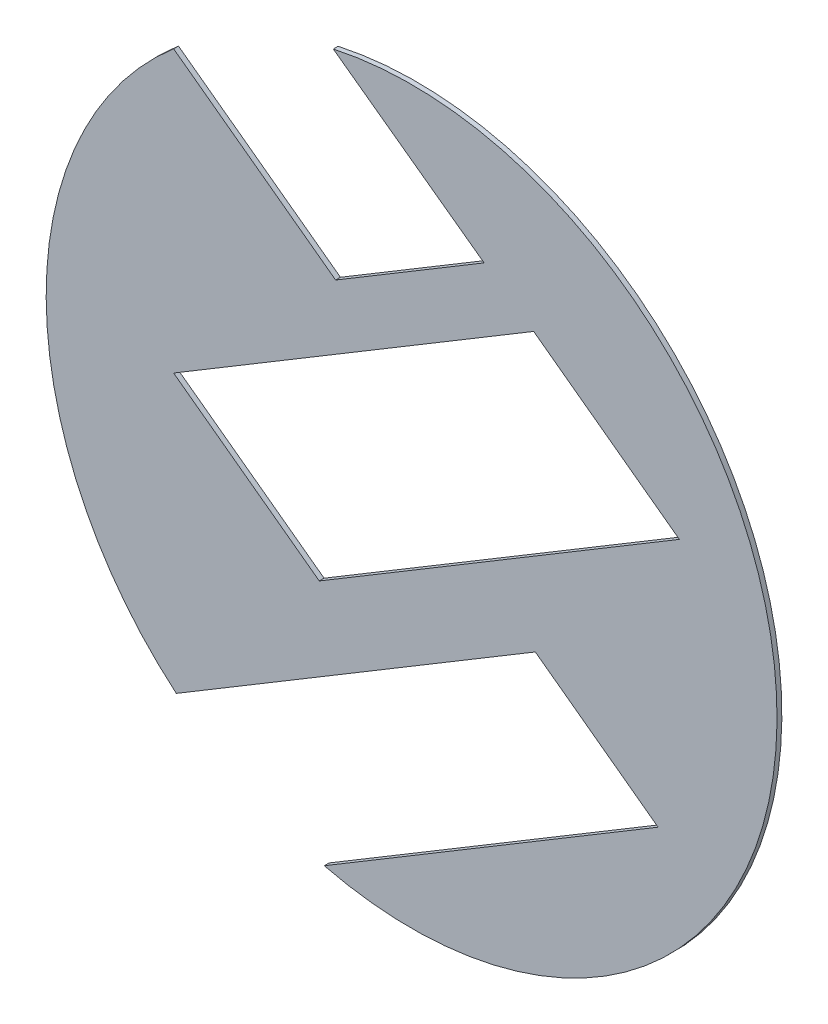
ISO-10303-21;
HEADER;
FILE_DESCRIPTION(('STEP AP214'),'2;1');
FILE_NAME('part.step','',(''),(''),'','','');
FILE_SCHEMA(('AUTOMOTIVE_DESIGN { 1 0 10303 214 1 1 1 1 }'));
ENDSEC;
DATA;
#1=APPLICATION_CONTEXT('core data for automotive mechanical design processes');
#2=APPLICATION_PROTOCOL_DEFINITION('international standard','automotive_design',2000,#1);
#3=PRODUCT_CONTEXT('',#1,'mechanical');
#4=PRODUCT('Part','Part','',(#3));
#5=PRODUCT_RELATED_PRODUCT_CATEGORY('part','',(#4));
#6=PRODUCT_DEFINITION_FORMATION('','',#4);
#7=PRODUCT_DEFINITION_CONTEXT('part definition',#1,'design');
#8=PRODUCT_DEFINITION('design','',#6,#7);
#9=PRODUCT_DEFINITION_SHAPE('','',#8);
#10=(LENGTH_UNIT() NAMED_UNIT(*) SI_UNIT(.MILLI.,.METRE.));
#11=(NAMED_UNIT(*) PLANE_ANGLE_UNIT() SI_UNIT($,.RADIAN.));
#12=(NAMED_UNIT(*) SI_UNIT($,.STERADIAN.) SOLID_ANGLE_UNIT());
#13=UNCERTAINTY_MEASURE_WITH_UNIT(LENGTH_MEASURE(1.E-05),#10,'distance_accuracy_value','');
#14=(GEOMETRIC_REPRESENTATION_CONTEXT(3) GLOBAL_UNCERTAINTY_ASSIGNED_CONTEXT((#13)) GLOBAL_UNIT_ASSIGNED_CONTEXT((#10,
#11,#12)) REPRESENTATION_CONTEXT('',''));
#15=CARTESIAN_POINT('',(0.,0.,0.));
#16=DIRECTION('',(0.,0.,1.));
#17=DIRECTION('',(1.,0.,0.));
#18=AXIS2_PLACEMENT_3D('',#15,#16,#17);
#19=CARTESIAN_POINT('',(32.574920494297,13.734089114766,2.64));
#20=DIRECTION('',(0.,0.,1.));
#21=DIRECTION('',(1.,0.,0.));
#22=AXIS2_PLACEMENT_3D('',#19,#20,#21);
#23=PLANE('',#22);
#24=DIRECTION('',(-0.857492968552989,-0.514495684026778,0.));
#25=VECTOR('',#24,1.);
#26=CARTESIAN_POINT('',(31.96764281084,16.658221601658,2.64));
#27=LINE('',#26,#25);
#28=CARTESIAN_POINT('',(31.9676428108399,16.6582216016581,2.64));
#29=VERTEX_POINT('',#28);
#30=CARTESIAN_POINT('',(31.2743120899405,16.2422232476328,2.64));
#31=VERTEX_POINT('',#30);
#32=EDGE_CURVE('E112',#29,#31,#27,.T.);
#33=ORIENTED_EDGE('',*,*,#32,.F.);
#34=DIRECTION('',(0.805324891886565,-0.592833719105022,0.));
#35=VECTOR('',#34,1.);
#36=CARTESIAN_POINT('',(31.712691111678,16.845902332167,2.64));
#37=LINE('',#36,#35);
#38=CARTESIAN_POINT('',(31.7126911116781,16.8459023321671,2.64));
#39=VERTEX_POINT('',#38);
#40=EDGE_CURVE('E110',#39,#29,#37,.T.);
#41=ORIENTED_EDGE('',*,*,#40,.F.);
#42=DIRECTION('',(0.857492968552828,0.514495684027046,0.));
#43=VECTOR('',#42,1.);
#44=CARTESIAN_POINT('',(30.967015287481,16.398496922091,2.64));
#45=LINE('',#44,#43);
#46=CARTESIAN_POINT('',(30.9670153066098,16.3984969335682,2.64));
#47=VERTEX_POINT('',#46);
#48=EDGE_CURVE('E98',#47,#39,#45,.T.);
#49=ORIENTED_EDGE('',*,*,#48,.F.);
#50=CARTESIAN_POINT('',(31.455723480902,16.979222091636,2.64));
#51=DIRECTION('',(0.,0.,-1.));
#52=DIRECTION('',(-1.,0.,0.));
#53=AXIS2_PLACEMENT_3D('',#50,#51,#52);
#54=CIRCLE('',#53,0.7589976);
#55=CARTESIAN_POINT('',(30.9614312897238,17.5552017670986,2.64));
#56=VERTEX_POINT('',#55);
#57=EDGE_CURVE('E20',#56,#47,#54,.F.);
#58=ORIENTED_EDGE('',*,*,#57,.F.);
#59=DIRECTION('',(-0.805324891886777,0.592833719104734,0.));
#60=VECTOR('',#59,1.);
#61=CARTESIAN_POINT('',(31.29792194646,17.307496766622,2.64));
#62=LINE('',#61,#60);
#63=CARTESIAN_POINT('',(31.29792194646,17.307496766622,2.64));
#64=VERTEX_POINT('',#63);
#65=EDGE_CURVE('E85',#64,#56,#62,.T.);
#66=ORIENTED_EDGE('',*,*,#65,.F.);
#67=DIRECTION('',(-0.857492968551301,-0.514495684029593,0.));
#68=VECTOR('',#67,1.);
#69=CARTESIAN_POINT('',(31.606329475251,17.492541248973,2.64));
#70=LINE('',#69,#68);
#71=CARTESIAN_POINT('',(31.6063294752512,17.4925412489727,2.64));
#72=VERTEX_POINT('',#71);
#73=EDGE_CURVE('E121',#72,#64,#70,.T.);
#74=ORIENTED_EDGE('',*,*,#73,.F.);
#75=DIRECTION('',(0.808430669272843,-0.588591414292685,0.));
#76=VECTOR('',#75,1.);
#77=CARTESIAN_POINT('',(31.293100053242,17.720593146935,2.64));
#78=LINE('',#77,#76);
#79=CARTESIAN_POINT('',(31.2931000760404,17.7205931303365,2.64));
#80=VERTEX_POINT('',#79);
#81=EDGE_CURVE('E124',#80,#72,#78,.T.);
#82=ORIENTED_EDGE('',*,*,#81,.F.);
#83=CARTESIAN_POINT('',(31.455723480902,16.979222091636,2.64));
#84=DIRECTION('',(0.,0.,-1.));
#85=DIRECTION('',(-1.,0.,0.));
#86=AXIS2_PLACEMENT_3D('',#83,#84,#85);
#87=CIRCLE('',#86,0.7589976);
#88=EDGE_CURVE('E140',#31,#80,#87,.F.);
#89=ORIENTED_EDGE('',*,*,#88,.F.);
#90=EDGE_LOOP('',(#33,#41,#49,#58,#66,#74,#82,#89));
#91=FACE_BOUND('',#90,.T.);
#92=DIRECTION('',(0.805324891887206,-0.592833719104152,0.));
#93=VECTOR('',#92,1.);
#94=CARTESIAN_POINT('',(31.112709321755,16.860628226809,2.64));
#95=LINE('',#94,#93);
#96=CARTESIAN_POINT('',(30.961431258546,16.9719904083761,2.64));
#97=VERTEX_POINT('',#96);
#98=CARTESIAN_POINT('',(31.2639873849641,16.749266045241,2.64));
#99=VERTEX_POINT('',#98);
#100=EDGE_CURVE('E151',#97,#99,#95,.T.);
#101=ORIENTED_EDGE('',*,*,#100,.T.);
#102=DIRECTION('',(0.857492968552453,0.514495684027672,0.));
#103=VECTOR('',#102,1.);
#104=CARTESIAN_POINT('',(31.63791421358,16.973622100066,2.64));
#105=LINE('',#104,#103);
#106=CARTESIAN_POINT('',(32.0118410421951,17.1979781548911,2.64));
#107=VERTEX_POINT('',#106);
#108=EDGE_CURVE('E168',#99,#107,#105,.T.);
#109=ORIENTED_EDGE('',*,*,#108,.T.);
#110=DIRECTION('',(-0.805324891887206,0.592833719104152,0.));
#111=VECTOR('',#110,1.);
#112=CARTESIAN_POINT('',(31.860562978986,17.309340336459,2.64));
#113=LINE('',#112,#111);
#114=CARTESIAN_POINT('',(31.7092849157761,17.4207025180262,2.64));
#115=VERTEX_POINT('',#114);
#116=EDGE_CURVE('E174',#107,#115,#113,.T.);
#117=ORIENTED_EDGE('',*,*,#116,.T.);
#118=DIRECTION('',(-0.857492968552453,-0.514495684027672,0.));
#119=VECTOR('',#118,1.);
#120=CARTESIAN_POINT('',(31.335358087161,17.196346463201,2.64));
#121=LINE('',#120,#119);
#122=EDGE_CURVE('E177',#115,#97,#121,.T.);
#123=ORIENTED_EDGE('',*,*,#122,.T.);
#124=EDGE_LOOP('',(#101,#109,#117,#123));
#125=FACE_BOUND('',#124,.T.);
#126=ADVANCED_FACE('F17',(#91,#125),#23,.F.);
#127=CARTESIAN_POINT('',(31.335358087161,17.196346463201,2.64));
#128=DIRECTION('',(-0.514495684027672,0.857492968552453,0.));
#129=DIRECTION('',(-0.857492968552453,-0.514495684027672,0.));
#130=AXIS2_PLACEMENT_3D('',#127,#128,#129);
#131=PLANE('',#130);
#132=DIRECTION('',(0.,0.,1.));
#133=VECTOR('',#132,1.);
#134=CARTESIAN_POINT('',(30.9614312585462,16.9719904083762,2.64));
#135=LINE('',#134,#133);
#136=CARTESIAN_POINT('',(30.961431258546,16.9719904083761,2.65));
#137=VERTEX_POINT('',#136);
#138=EDGE_CURVE('E159',#137,#97,#135,.F.);
#139=ORIENTED_EDGE('',*,*,#138,.T.);
#140=ORIENTED_EDGE('',*,*,#122,.F.);
#141=DIRECTION('',(0.,0.,1.));
#142=VECTOR('',#141,1.);
#143=CARTESIAN_POINT('',(31.7092849157765,17.4207025180267,2.64));
#144=LINE('',#143,#142);
#145=CARTESIAN_POINT('',(31.7092849157761,17.4207025180262,2.65));
#146=VERTEX_POINT('',#145);
#147=EDGE_CURVE('E171',#115,#146,#144,.T.);
#148=ORIENTED_EDGE('',*,*,#147,.T.);
#149=DIRECTION('',(0.857492968552414,0.514495684027737,0.));
#150=VECTOR('',#149,1.);
#151=CARTESIAN_POINT('',(30.961431258546,16.971990408376,2.65));
#152=LINE('',#151,#150);
#153=EDGE_CURVE('E185',#137,#146,#152,.T.);
#154=ORIENTED_EDGE('',*,*,#153,.F.);
#155=EDGE_LOOP('',(#139,#140,#148,#154));
#156=FACE_BOUND('',#155,.T.);
#157=ADVANCED_FACE('F328',(#156),#131,.F.);
#158=CARTESIAN_POINT('',(31.860562978986,17.309340336459,2.64));
#159=DIRECTION('',(0.592833719104152,0.805324891887206,0.));
#160=DIRECTION('',(-0.805324891887206,0.592833719104152,0.));
#161=AXIS2_PLACEMENT_3D('',#158,#159,#160);
#162=PLANE('',#161);
#163=ORIENTED_EDGE('',*,*,#147,.F.);
#164=ORIENTED_EDGE('',*,*,#116,.F.);
#165=DIRECTION('',(0.,0.,1.));
#166=VECTOR('',#165,1.);
#167=CARTESIAN_POINT('',(32.011841042195,17.197978154891,2.64));
#168=LINE('',#167,#166);
#169=CARTESIAN_POINT('',(32.0118410421952,17.1979781548912,2.65));
#170=VERTEX_POINT('',#169);
#171=EDGE_CURVE('E165',#107,#170,#168,.T.);
#172=ORIENTED_EDGE('',*,*,#171,.T.);
#173=DIRECTION('',(0.805324891887812,-0.592833719103329,0.));
#174=VECTOR('',#173,1.);
#175=CARTESIAN_POINT('',(31.709284915776,17.420702518026,2.65));
#176=LINE('',#175,#174);
#177=EDGE_CURVE('E188',#146,#170,#176,.T.);
#178=ORIENTED_EDGE('',*,*,#177,.F.);
#179=EDGE_LOOP('',(#163,#164,#172,#178));
#180=FACE_BOUND('',#179,.T.);
#181=ADVANCED_FACE('F319',(#180),#162,.F.);
#182=CARTESIAN_POINT('',(31.63791421358,16.973622100066,2.64));
#183=DIRECTION('',(0.514495684027672,-0.857492968552453,0.));
#184=DIRECTION('',(0.857492968552453,0.514495684027672,0.));
#185=AXIS2_PLACEMENT_3D('',#182,#183,#184);
#186=PLANE('',#185);
#187=ORIENTED_EDGE('',*,*,#171,.F.);
#188=ORIENTED_EDGE('',*,*,#108,.F.);
#189=DIRECTION('',(0.,0.,1.));
#190=VECTOR('',#189,1.);
#191=CARTESIAN_POINT('',(31.2639873849643,16.7492660452414,2.64));
#192=LINE('',#191,#190);
#193=CARTESIAN_POINT('',(31.2639873849642,16.7492660452409,2.65));
#194=VERTEX_POINT('',#193);
#195=EDGE_CURVE('E143',#99,#194,#192,.T.);
#196=ORIENTED_EDGE('',*,*,#195,.T.);
#197=DIRECTION('',(-0.857492968552718,-0.514495684027231,0.));
#198=VECTOR('',#197,1.);
#199=CARTESIAN_POINT('',(32.011841042195,17.197978154891,2.65));
#200=LINE('',#199,#198);
#201=EDGE_CURVE('E364',#170,#194,#200,.T.);
#202=ORIENTED_EDGE('',*,*,#201,.F.);
#203=EDGE_LOOP('',(#187,#188,#196,#202));
#204=FACE_BOUND('',#203,.T.);
#205=ADVANCED_FACE('F309',(#204),#186,.F.);
#206=CARTESIAN_POINT('',(31.112709321755,16.860628226809,2.64));
#207=DIRECTION('',(-0.592833719104152,-0.805324891887206,0.));
#208=DIRECTION('',(0.805324891887206,-0.592833719104152,0.));
#209=AXIS2_PLACEMENT_3D('',#206,#207,#208);
#210=PLANE('',#209);
#211=ORIENTED_EDGE('',*,*,#195,.F.);
#212=ORIENTED_EDGE('',*,*,#100,.F.);
#213=ORIENTED_EDGE('',*,*,#138,.F.);
#214=DIRECTION('',(-0.805324891886866,0.592833719104613,0.));
#215=VECTOR('',#214,1.);
#216=CARTESIAN_POINT('',(31.263987384964,16.749266045241,2.65));
#217=LINE('',#216,#215);
#218=EDGE_CURVE('E139',#194,#137,#217,.T.);
#219=ORIENTED_EDGE('',*,*,#218,.F.);
#220=EDGE_LOOP('',(#211,#212,#213,#219));
#221=FACE_BOUND('',#220,.T.);
#222=ADVANCED_FACE('F300',(#221),#210,.F.);
#223=CARTESIAN_POINT('',(31.455723480902,16.979222091636,2.64));
#224=DIRECTION('',(0.,0.,-1.));
#225=DIRECTION('',(-1.,0.,0.));
#226=AXIS2_PLACEMENT_3D('',#223,#224,#225);
#227=CYLINDRICAL_SURFACE('',#226,0.7589976);
#228=ORIENTED_EDGE('',*,*,#88,.T.);
#229=DIRECTION('',(0.,0.,1.));
#230=VECTOR('',#229,1.);
#231=CARTESIAN_POINT('',(31.2931000532422,17.7205931469353,2.64));
#232=LINE('',#231,#230);
#233=CARTESIAN_POINT('',(31.2931000760404,17.7205931303365,2.65));
#234=VERTEX_POINT('',#233);
#235=EDGE_CURVE('E142',#234,#80,#232,.F.);
#236=ORIENTED_EDGE('',*,*,#235,.F.);
#237=CARTESIAN_POINT('',(31.455723480902,16.979222091636,2.65));
#238=DIRECTION('',(0.,0.,-1.));
#239=DIRECTION('',(-1.,0.,0.));
#240=AXIS2_PLACEMENT_3D('',#237,#238,#239);
#241=CIRCLE('',#240,0.7589976);
#242=CARTESIAN_POINT('',(31.2743120899405,16.2422232476328,2.65));
#243=VERTEX_POINT('',#242);
#244=EDGE_CURVE('E136',#243,#234,#241,.F.);
#245=ORIENTED_EDGE('',*,*,#244,.F.);
#246=DIRECTION('',(0.,0.,1.));
#247=VECTOR('',#246,1.);
#248=CARTESIAN_POINT('',(31.2743120642622,16.2422232322256,2.64));
#249=LINE('',#248,#247);
#250=EDGE_CURVE('E182',#31,#243,#249,.T.);
#251=ORIENTED_EDGE('',*,*,#250,.F.);
#252=EDGE_LOOP('',(#228,#236,#245,#251));
#253=FACE_BOUND('',#252,.T.);
#254=ADVANCED_FACE('F184',(#253),#227,.T.);
#255=CARTESIAN_POINT('',(31.449714764247,17.606567197954,2.64));
#256=DIRECTION('',(-0.588591414292816,-0.808430669272748,0.));
#257=DIRECTION('',(0.808430669272748,-0.588591414292816,0.));
#258=AXIS2_PLACEMENT_3D('',#255,#256,#257);
#259=PLANE('',#258);
#260=ORIENTED_EDGE('',*,*,#81,.T.);
#261=DIRECTION('',(0.,0.,1.));
#262=VECTOR('',#261,1.);
#263=CARTESIAN_POINT('',(31.6063294752516,17.4925412489721,2.64));
#264=LINE('',#263,#262);
#265=CARTESIAN_POINT('',(31.6063294752512,17.4925412489727,2.65));
#266=VERTEX_POINT('',#265);
#267=EDGE_CURVE('E148',#266,#72,#264,.F.);
#268=ORIENTED_EDGE('',*,*,#267,.F.);
#269=DIRECTION('',(0.808430669272843,-0.588591414292685,0.));
#270=VECTOR('',#269,1.);
#271=CARTESIAN_POINT('',(31.293100053242,17.720593146935,2.65));
#272=LINE('',#271,#270);
#273=EDGE_CURVE('E138',#234,#266,#272,.T.);
#274=ORIENTED_EDGE('',*,*,#273,.F.);
#275=ORIENTED_EDGE('',*,*,#235,.T.);
#276=EDGE_LOOP('',(#260,#268,#274,#275));
#277=FACE_BOUND('',#276,.T.);
#278=ADVANCED_FACE('F220',(#277),#259,.T.);
#279=CARTESIAN_POINT('',(31.452125710856,17.400019007797,2.64));
#280=DIRECTION('',(-0.514495684027672,0.857492968552453,0.));
#281=DIRECTION('',(-0.857492968552453,-0.514495684027672,0.));
#282=AXIS2_PLACEMENT_3D('',#279,#280,#281);
#283=PLANE('',#282);
#284=ORIENTED_EDGE('',*,*,#73,.T.);
#285=DIRECTION('',(0.,0.,1.));
#286=VECTOR('',#285,1.);
#287=CARTESIAN_POINT('',(31.2979219464601,17.3074967666221,2.64));
#288=LINE('',#287,#286);
#289=CARTESIAN_POINT('',(31.29792194646,17.307496766622,2.65));
#290=VERTEX_POINT('',#289);
#291=EDGE_CURVE('E203',#290,#64,#288,.F.);
#292=ORIENTED_EDGE('',*,*,#291,.F.);
#293=DIRECTION('',(-0.857492968551301,-0.514495684029593,0.));
#294=VECTOR('',#293,1.);
#295=CARTESIAN_POINT('',(31.606329475251,17.492541248973,2.65));
#296=LINE('',#295,#294);
#297=EDGE_CURVE('E207',#266,#290,#296,.T.);
#298=ORIENTED_EDGE('',*,*,#297,.F.);
#299=ORIENTED_EDGE('',*,*,#267,.T.);
#300=EDGE_LOOP('',(#284,#292,#298,#299));
#301=FACE_BOUND('',#300,.T.);
#302=ADVANCED_FACE('F216',(#301),#283,.T.);
#303=CARTESIAN_POINT('',(31.129676602503,17.431349281284,2.64));
#304=DIRECTION('',(0.592833719104152,0.805324891887206,0.));
#305=DIRECTION('',(-0.805324891887206,0.592833719104152,0.));
#306=AXIS2_PLACEMENT_3D('',#303,#304,#305);
#307=PLANE('',#306);
#308=ORIENTED_EDGE('',*,*,#65,.T.);
#309=DIRECTION('',(0.,0.,-1.));
#310=VECTOR('',#309,1.);
#311=CARTESIAN_POINT('',(30.9614312860257,17.555201763925,2.64));
#312=LINE('',#311,#310);
#313=CARTESIAN_POINT('',(30.9614312897238,17.5552017670986,2.65));
#314=VERTEX_POINT('',#313);
#315=EDGE_CURVE('E95',#314,#56,#312,.T.);
#316=ORIENTED_EDGE('',*,*,#315,.F.);
#317=DIRECTION('',(-0.805324891886777,0.592833719104734,0.));
#318=VECTOR('',#317,1.);
#319=CARTESIAN_POINT('',(31.29792194646,17.307496766622,2.65));
#320=LINE('',#319,#318);
#321=EDGE_CURVE('E135',#290,#314,#320,.T.);
#322=ORIENTED_EDGE('',*,*,#321,.F.);
#323=ORIENTED_EDGE('',*,*,#291,.T.);
#324=EDGE_LOOP('',(#308,#316,#322,#323));
#325=FACE_BOUND('',#324,.T.);
#326=ADVANCED_FACE('F267',(#325),#307,.T.);
#327=CARTESIAN_POINT('',(31.455723480902,16.979222091636,2.64));
#328=DIRECTION('',(0.,0.,-1.));
#329=DIRECTION('',(-1.,0.,0.));
#330=AXIS2_PLACEMENT_3D('',#327,#328,#329);
#331=CYLINDRICAL_SURFACE('',#330,0.7589976);
#332=ORIENTED_EDGE('',*,*,#57,.T.);
#333=DIRECTION('',(0.,0.,1.));
#334=VECTOR('',#333,1.);
#335=CARTESIAN_POINT('',(30.967015287481,16.3984969220909,2.64));
#336=LINE('',#335,#334);
#337=CARTESIAN_POINT('',(30.9670153066098,16.3984969335682,2.65));
#338=VERTEX_POINT('',#337);
#339=EDGE_CURVE('E93',#47,#338,#336,.T.);
#340=ORIENTED_EDGE('',*,*,#339,.T.);
#341=CARTESIAN_POINT('',(31.455723480902,16.979222091636,2.65));
#342=DIRECTION('',(0.,0.,-1.));
#343=DIRECTION('',(-1.,0.,0.));
#344=AXIS2_PLACEMENT_3D('',#341,#342,#343);
#345=CIRCLE('',#344,0.7589976);
#346=EDGE_CURVE('E133',#314,#338,#345,.F.);
#347=ORIENTED_EDGE('',*,*,#346,.F.);
#348=ORIENTED_EDGE('',*,*,#315,.T.);
#349=EDGE_LOOP('',(#332,#340,#347,#348));
#350=FACE_BOUND('',#349,.T.);
#351=ADVANCED_FACE('F91',(#350),#331,.T.);
#352=CARTESIAN_POINT('',(31.339853199579,16.622199627129,2.64));
#353=DIRECTION('',(-0.514495684027672,0.857492968552453,0.));
#354=DIRECTION('',(-0.857492968552453,-0.514495684027672,0.));
#355=AXIS2_PLACEMENT_3D('',#352,#353,#354);
#356=PLANE('',#355);
#357=ORIENTED_EDGE('',*,*,#339,.F.);
#358=ORIENTED_EDGE('',*,*,#48,.T.);
#359=DIRECTION('',(0.,0.,1.));
#360=VECTOR('',#359,1.);
#361=CARTESIAN_POINT('',(31.7126911116781,16.8459023321672,2.64));
#362=LINE('',#361,#360);
#363=CARTESIAN_POINT('',(31.7126911116781,16.8459023321671,2.65));
#364=VERTEX_POINT('',#363);
#365=EDGE_CURVE('E105',#364,#39,#362,.F.);
#366=ORIENTED_EDGE('',*,*,#365,.F.);
#367=DIRECTION('',(0.857492968552828,0.514495684027046,0.));
#368=VECTOR('',#367,1.);
#369=CARTESIAN_POINT('',(30.967015287481,16.398496922091,2.65));
#370=LINE('',#369,#368);
#371=EDGE_CURVE('E103',#338,#364,#370,.T.);
#372=ORIENTED_EDGE('',*,*,#371,.F.);
#373=EDGE_LOOP('',(#357,#358,#366,#372));
#374=FACE_BOUND('',#373,.T.);
#375=ADVANCED_FACE('F100',(#374),#356,.F.);
#376=CARTESIAN_POINT('',(31.840166961259,16.752061966913,2.64));
#377=DIRECTION('',(-0.592833719104152,-0.805324891887206,0.));
#378=DIRECTION('',(0.805324891887206,-0.592833719104152,0.));
#379=AXIS2_PLACEMENT_3D('',#376,#377,#378);
#380=PLANE('',#379);
#381=ORIENTED_EDGE('',*,*,#40,.T.);
#382=DIRECTION('',(0.,0.,1.));
#383=VECTOR('',#382,1.);
#384=CARTESIAN_POINT('',(31.9676428108398,16.6582216016584,2.64));
#385=LINE('',#384,#383);
#386=CARTESIAN_POINT('',(31.9676428108399,16.6582216016581,2.65));
#387=VERTEX_POINT('',#386);
#388=EDGE_CURVE('E35',#387,#29,#385,.F.);
#389=ORIENTED_EDGE('',*,*,#388,.F.);
#390=DIRECTION('',(0.805324891886565,-0.592833719105022,0.));
#391=VECTOR('',#390,1.);
#392=CARTESIAN_POINT('',(31.712691111678,16.845902332167,2.65));
#393=LINE('',#392,#391);
#394=EDGE_CURVE('E26',#364,#387,#393,.T.);
#395=ORIENTED_EDGE('',*,*,#394,.F.);
#396=ORIENTED_EDGE('',*,*,#365,.T.);
#397=EDGE_LOOP('',(#381,#389,#395,#396));
#398=FACE_BOUND('',#397,.T.);
#399=ADVANCED_FACE('F225',(#398),#380,.T.);
#400=CARTESIAN_POINT('',(31.620977437551,16.450222416942,2.64));
#401=DIRECTION('',(-0.514495684027672,0.857492968552453,0.));
#402=DIRECTION('',(-0.857492968552453,-0.514495684027672,0.));
#403=AXIS2_PLACEMENT_3D('',#400,#401,#402);
#404=PLANE('',#403);
#405=ORIENTED_EDGE('',*,*,#32,.T.);
#406=ORIENTED_EDGE('',*,*,#250,.T.);
#407=DIRECTION('',(-0.857492968552989,-0.514495684026778,0.));
#408=VECTOR('',#407,1.);
#409=CARTESIAN_POINT('',(31.96764281084,16.658221601658,2.65));
#410=LINE('',#409,#408);
#411=EDGE_CURVE('E11',#387,#243,#410,.T.);
#412=ORIENTED_EDGE('',*,*,#411,.F.);
#413=ORIENTED_EDGE('',*,*,#388,.T.);
#414=EDGE_LOOP('',(#405,#406,#412,#413));
#415=FACE_BOUND('',#414,.T.);
#416=ADVANCED_FACE('F181',(#415),#404,.T.);
#417=CARTESIAN_POINT('',(32.574920494297,13.734089114766,2.65));
#418=DIRECTION('',(0.,0.,1.));
#419=DIRECTION('',(1.,0.,0.));
#420=AXIS2_PLACEMENT_3D('',#417,#418,#419);
#421=PLANE('',#420);
#422=ORIENTED_EDGE('',*,*,#394,.T.);
#423=ORIENTED_EDGE('',*,*,#411,.T.);
#424=ORIENTED_EDGE('',*,*,#244,.T.);
#425=ORIENTED_EDGE('',*,*,#273,.T.);
#426=ORIENTED_EDGE('',*,*,#297,.T.);
#427=ORIENTED_EDGE('',*,*,#321,.T.);
#428=ORIENTED_EDGE('',*,*,#346,.T.);
#429=ORIENTED_EDGE('',*,*,#371,.T.);
#430=EDGE_LOOP('',(#422,#423,#424,#425,#426,#427,#428,#429));
#431=FACE_BOUND('',#430,.T.);
#432=ORIENTED_EDGE('',*,*,#201,.T.);
#433=ORIENTED_EDGE('',*,*,#218,.T.);
#434=ORIENTED_EDGE('',*,*,#153,.T.);
#435=ORIENTED_EDGE('',*,*,#177,.T.);
#436=EDGE_LOOP('',(#432,#433,#434,#435));
#437=FACE_BOUND('',#436,.T.);
#438=ADVANCED_FACE('F223',(#431,#437),#421,.T.);
#439=CLOSED_SHELL('',(#126,#157,#181,#205,#222,#254,#278,#302,#326,#351,#375,#399,#416,#438));
#440=MANIFOLD_SOLID_BREP('B1',#439);
#441=ADVANCED_BREP_SHAPE_REPRESENTATION('',(#18,#440),#14);
#442=SHAPE_DEFINITION_REPRESENTATION(#9,#441);
ENDSEC;
END-ISO-10303-21;
